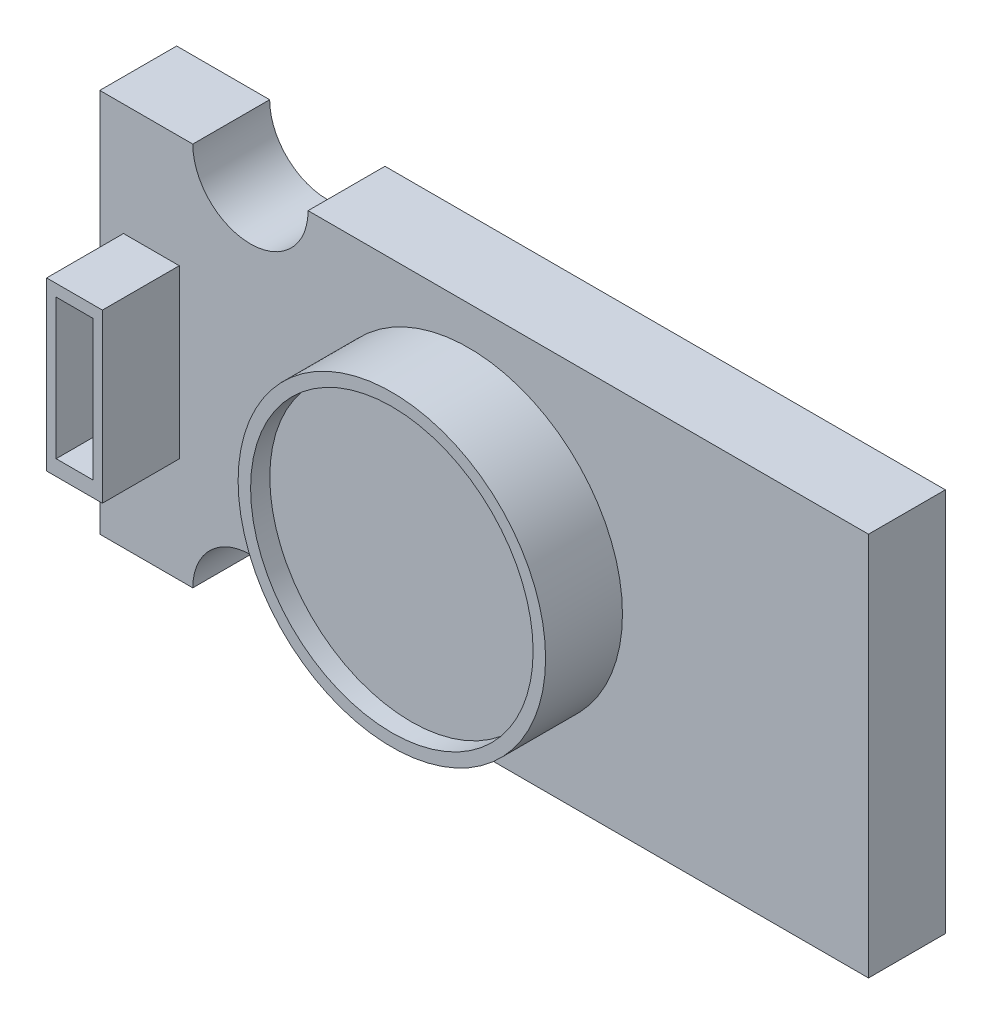
ISO-10303-21;
HEADER;
FILE_DESCRIPTION(('STEP AP214'),'2;1');
FILE_NAME('part.step','',(''),(''),'','','');
FILE_SCHEMA(('AUTOMOTIVE_DESIGN { 1 0 10303 214 1 1 1 1 }'));
ENDSEC;
DATA;
#1=APPLICATION_CONTEXT('core data for automotive mechanical design processes');
#2=APPLICATION_PROTOCOL_DEFINITION('international standard','automotive_design',2000,#1);
#3=PRODUCT_CONTEXT('',#1,'mechanical');
#4=PRODUCT('Part','Part','',(#3));
#5=PRODUCT_RELATED_PRODUCT_CATEGORY('part','',(#4));
#6=PRODUCT_DEFINITION_FORMATION('','',#4);
#7=PRODUCT_DEFINITION_CONTEXT('part definition',#1,'design');
#8=PRODUCT_DEFINITION('design','',#6,#7);
#9=PRODUCT_DEFINITION_SHAPE('','',#8);
#10=(LENGTH_UNIT() NAMED_UNIT(*) SI_UNIT(.MILLI.,.METRE.));
#11=(NAMED_UNIT(*) PLANE_ANGLE_UNIT() SI_UNIT($,.RADIAN.));
#12=(NAMED_UNIT(*) SI_UNIT($,.STERADIAN.) SOLID_ANGLE_UNIT());
#13=UNCERTAINTY_MEASURE_WITH_UNIT(LENGTH_MEASURE(1.E-05),#10,'distance_accuracy_value','');
#14=(GEOMETRIC_REPRESENTATION_CONTEXT(3) GLOBAL_UNCERTAINTY_ASSIGNED_CONTEXT((#13)) GLOBAL_UNIT_ASSIGNED_CONTEXT((#10,
#11,#12)) REPRESENTATION_CONTEXT('',''));
#15=CARTESIAN_POINT('',(0.,0.,0.));
#16=DIRECTION('',(0.,0.,1.));
#17=DIRECTION('',(1.,0.,0.));
#18=AXIS2_PLACEMENT_3D('',#15,#16,#17);
#19=CARTESIAN_POINT('',(0.,0.,2.));
#20=DIRECTION('',(0.,0.,1.));
#21=DIRECTION('',(1.,0.,0.));
#22=AXIS2_PLACEMENT_3D('',#19,#20,#21);
#23=PLANE('',#22);
#24=CARTESIAN_POINT('',(1.18172324453648,3.6206896551724,2.));
#25=DIRECTION('',(0.,0.,1.));
#26=DIRECTION('',(1.,0.,0.));
#27=AXIS2_PLACEMENT_3D('',#24,#25,#26);
#28=CIRCLE('',#27,4.);
#29=CARTESIAN_POINT('',(5.18172324453649,3.6206896551724,2.));
#30=VERTEX_POINT('',#29);
#31=EDGE_CURVE('E215',#30,#30,#28,.T.);
#32=ORIENTED_EDGE('',*,*,#31,.F.);
#33=EDGE_LOOP('',(#32));
#34=FACE_BOUND('',#33,.T.);
#35=CARTESIAN_POINT('',(-4.49737673402625,-1.37931034482759,2.));
#36=DIRECTION('',(0.,0.,1.));
#37=DIRECTION('',(1.,0.,0.));
#38=AXIS2_PLACEMENT_3D('',#35,#36,#37);
#39=CIRCLE('',#38,1.5);
#40=CARTESIAN_POINT('',(-2.99737673402625,-1.37931034482759,2.));
#41=VERTEX_POINT('',#40);
#42=CARTESIAN_POINT('',(-5.99737673402625,-1.37931034482759,2.));
#43=VERTEX_POINT('',#42);
#44=EDGE_CURVE('E221',#41,#43,#39,.T.);
#45=ORIENTED_EDGE('',*,*,#44,.F.);
#46=DIRECTION('',(1.,0.,0.));
#47=VECTOR('',#46,1.);
#48=CARTESIAN_POINT('',(-8.41703599610854,-1.37931034482759,2.));
#49=LINE('',#48,#47);
#50=CARTESIAN_POINT('',(11.5829640038915,-1.37931034482759,2.));
#51=VERTEX_POINT('',#50);
#52=EDGE_CURVE('E246',#41,#51,#49,.T.);
#53=ORIENTED_EDGE('',*,*,#52,.T.);
#54=DIRECTION('',(0.,1.,0.));
#55=VECTOR('',#54,1.);
#56=CARTESIAN_POINT('',(11.5829640038915,8.62068965517241,2.));
#57=LINE('',#56,#55);
#58=CARTESIAN_POINT('',(11.5829640038915,8.62068965517241,2.));
#59=VERTEX_POINT('',#58);
#60=EDGE_CURVE('E251',#51,#59,#57,.T.);
#61=ORIENTED_EDGE('',*,*,#60,.T.);
#62=DIRECTION('',(-1.,0.,0.));
#63=VECTOR('',#62,1.);
#64=CARTESIAN_POINT('',(-8.41703599610854,8.62068965517241,2.));
#65=LINE('',#64,#63);
#66=CARTESIAN_POINT('',(-2.99737673402625,8.62068965517241,2.));
#67=VERTEX_POINT('',#66);
#68=EDGE_CURVE('E254',#59,#67,#65,.T.);
#69=ORIENTED_EDGE('',*,*,#68,.T.);
#70=CARTESIAN_POINT('',(-4.49737673402625,8.62068965517241,2.));
#71=DIRECTION('',(0.,0.,1.));
#72=DIRECTION('',(1.,0.,0.));
#73=AXIS2_PLACEMENT_3D('',#70,#71,#72);
#74=CIRCLE('',#73,1.5);
#75=CARTESIAN_POINT('',(-5.99737673402625,8.62068965517241,2.));
#76=VERTEX_POINT('',#75);
#77=EDGE_CURVE('E234',#76,#67,#74,.T.);
#78=ORIENTED_EDGE('',*,*,#77,.F.);
#79=CARTESIAN_POINT('',(-8.41703599610854,8.62068965517241,2.));
#80=VERTEX_POINT('',#79);
#81=EDGE_CURVE('E253',#76,#80,#65,.T.);
#82=ORIENTED_EDGE('',*,*,#81,.T.);
#83=DIRECTION('',(0.,-1.,0.));
#84=VECTOR('',#83,1.);
#85=CARTESIAN_POINT('',(-8.41703599610854,8.62068965517241,2.));
#86=LINE('',#85,#84);
#87=CARTESIAN_POINT('',(-8.41703599610854,-1.37931034482759,2.));
#88=VERTEX_POINT('',#87);
#89=EDGE_CURVE('E243',#80,#88,#86,.T.);
#90=ORIENTED_EDGE('',*,*,#89,.T.);
#91=EDGE_CURVE('E248',#88,#43,#49,.T.);
#92=ORIENTED_EDGE('',*,*,#91,.T.);
#93=EDGE_LOOP('',(#45,#53,#61,#69,#78,#82,#90,#92));
#94=FACE_BOUND('',#93,.T.);
#95=DIRECTION('',(1.,0.,0.));
#96=VECTOR('',#95,1.);
#97=CARTESIAN_POINT('',(-7.79989683025566,1.35213613112697,2.));
#98=LINE('',#97,#96);
#99=CARTESIAN_POINT('',(-7.79989683025566,1.35213613112697,2.));
#100=VERTEX_POINT('',#99);
#101=CARTESIAN_POINT('',(-6.34925716181844,1.35213613112697,2.));
#102=VERTEX_POINT('',#101);
#103=EDGE_CURVE('E198',#100,#102,#98,.T.);
#104=ORIENTED_EDGE('',*,*,#103,.F.);
#105=DIRECTION('',(0.,-1.,0.));
#106=VECTOR('',#105,1.);
#107=CARTESIAN_POINT('',(-7.79989683025566,5.70405513643863,2.));
#108=LINE('',#107,#106);
#109=CARTESIAN_POINT('',(-7.79989683025566,5.70405513643863,2.));
#110=VERTEX_POINT('',#109);
#111=EDGE_CURVE('E181',#110,#100,#108,.T.);
#112=ORIENTED_EDGE('',*,*,#111,.F.);
#113=DIRECTION('',(-1.,0.,0.));
#114=VECTOR('',#113,1.);
#115=CARTESIAN_POINT('',(-7.79989683025566,5.70405513643863,2.));
#116=LINE('',#115,#114);
#117=CARTESIAN_POINT('',(-6.34925716181844,5.70405513643863,2.));
#118=VERTEX_POINT('',#117);
#119=EDGE_CURVE('E189',#118,#110,#116,.T.);
#120=ORIENTED_EDGE('',*,*,#119,.F.);
#121=DIRECTION('',(0.,1.,0.));
#122=VECTOR('',#121,1.);
#123=CARTESIAN_POINT('',(-6.34925716181844,5.70405513643863,2.));
#124=LINE('',#123,#122);
#125=EDGE_CURVE('E200',#102,#118,#124,.T.);
#126=ORIENTED_EDGE('',*,*,#125,.F.);
#127=EDGE_LOOP('',(#104,#112,#120,#126));
#128=FACE_BOUND('',#127,.T.);
#129=ADVANCED_FACE('F32',(#34,#94,#128),#23,.T.);
#130=CARTESIAN_POINT('',(-8.41703599610854,-1.37931034482759,2.));
#131=DIRECTION('',(0.,1.,0.));
#132=DIRECTION('',(0.,0.,1.));
#133=AXIS2_PLACEMENT_3D('',#130,#131,#132);
#134=PLANE('',#133);
#135=DIRECTION('',(1.,0.,0.));
#136=VECTOR('',#135,1.);
#137=CARTESIAN_POINT('',(-8.41703599610854,-1.37931034482759,0.));
#138=LINE('',#137,#136);
#139=CARTESIAN_POINT('',(-8.41703599610854,-1.37931034482759,0.));
#140=VERTEX_POINT('',#139);
#141=CARTESIAN_POINT('',(-5.99737673402625,-1.37931034482759,0.));
#142=VERTEX_POINT('',#141);
#143=EDGE_CURVE('E261',#140,#142,#138,.T.);
#144=ORIENTED_EDGE('',*,*,#143,.T.);
#145=DIRECTION('',(0.,0.,1.));
#146=VECTOR('',#145,1.);
#147=CARTESIAN_POINT('',(-5.99737673402625,-1.37931034482759,0.));
#148=LINE('',#147,#146);
#149=EDGE_CURVE('E231',#142,#43,#148,.T.);
#150=ORIENTED_EDGE('',*,*,#149,.T.);
#151=ORIENTED_EDGE('',*,*,#91,.F.);
#152=DIRECTION('',(0.,0.,-1.));
#153=VECTOR('',#152,1.);
#154=CARTESIAN_POINT('',(-8.41703599610854,-1.37931034482759,2.));
#155=LINE('',#154,#153);
#156=EDGE_CURVE('E40',#88,#140,#155,.T.);
#157=ORIENTED_EDGE('',*,*,#156,.T.);
#158=EDGE_LOOP('',(#144,#150,#151,#157));
#159=FACE_BOUND('',#158,.T.);
#160=ADVANCED_FACE('F279',(#159),#134,.F.);
#161=CARTESIAN_POINT('',(-8.41703599610854,8.62068965517241,2.));
#162=DIRECTION('',(0.,-1.,0.));
#163=DIRECTION('',(0.,0.,-1.));
#164=AXIS2_PLACEMENT_3D('',#161,#162,#163);
#165=PLANE('',#164);
#166=DIRECTION('',(-1.,0.,0.));
#167=VECTOR('',#166,1.);
#168=CARTESIAN_POINT('',(-8.41703599610854,8.62068965517241,0.));
#169=LINE('',#168,#167);
#170=CARTESIAN_POINT('',(11.5829640038915,8.62068965517241,0.));
#171=VERTEX_POINT('',#170);
#172=CARTESIAN_POINT('',(-2.99737673402625,8.62068965517241,0.));
#173=VERTEX_POINT('',#172);
#174=EDGE_CURVE('E247',#171,#173,#169,.T.);
#175=ORIENTED_EDGE('',*,*,#174,.T.);
#176=DIRECTION('',(0.,0.,1.));
#177=VECTOR('',#176,1.);
#178=CARTESIAN_POINT('',(-2.99737673402625,8.62068965517241,0.));
#179=LINE('',#178,#177);
#180=EDGE_CURVE('E239',#173,#67,#179,.T.);
#181=ORIENTED_EDGE('',*,*,#180,.T.);
#182=ORIENTED_EDGE('',*,*,#68,.F.);
#183=DIRECTION('',(0.,0.,-1.));
#184=VECTOR('',#183,1.);
#185=CARTESIAN_POINT('',(11.5829640038915,8.62068965517241,2.));
#186=LINE('',#185,#184);
#187=EDGE_CURVE('E271',#59,#171,#186,.T.);
#188=ORIENTED_EDGE('',*,*,#187,.T.);
#189=EDGE_LOOP('',(#175,#181,#182,#188));
#190=FACE_BOUND('',#189,.T.);
#191=ADVANCED_FACE('F308',(#190),#165,.F.);
#192=CARTESIAN_POINT('',(-8.41703599610854,8.62068965517241,2.));
#193=DIRECTION('',(1.,0.,0.));
#194=DIRECTION('',(0.,0.,-1.));
#195=AXIS2_PLACEMENT_3D('',#192,#193,#194);
#196=PLANE('',#195);
#197=DIRECTION('',(0.,-1.,0.));
#198=VECTOR('',#197,1.);
#199=CARTESIAN_POINT('',(-8.41703599610854,8.62068965517241,0.));
#200=LINE('',#199,#198);
#201=CARTESIAN_POINT('',(-8.41703599610854,8.62068965517241,0.));
#202=VERTEX_POINT('',#201);
#203=EDGE_CURVE('E242',#202,#140,#200,.T.);
#204=ORIENTED_EDGE('',*,*,#203,.T.);
#205=ORIENTED_EDGE('',*,*,#156,.F.);
#206=ORIENTED_EDGE('',*,*,#89,.F.);
#207=DIRECTION('',(0.,0.,-1.));
#208=VECTOR('',#207,1.);
#209=CARTESIAN_POINT('',(-8.41703599610854,8.62068965517241,2.));
#210=LINE('',#209,#208);
#211=EDGE_CURVE('E257',#80,#202,#210,.T.);
#212=ORIENTED_EDGE('',*,*,#211,.T.);
#213=EDGE_LOOP('',(#204,#205,#206,#212));
#214=FACE_BOUND('',#213,.T.);
#215=ADVANCED_FACE('F34',(#214),#196,.F.);
#216=ORIENTED_EDGE('',*,*,#52,.F.);
#217=DIRECTION('',(0.,0.,1.));
#218=VECTOR('',#217,1.);
#219=CARTESIAN_POINT('',(-2.99737673402625,-1.37931034482759,0.));
#220=LINE('',#219,#218);
#221=CARTESIAN_POINT('',(-2.99737673402625,-1.37931034482759,0.));
#222=VERTEX_POINT('',#221);
#223=EDGE_CURVE('E227',#41,#222,#220,.F.);
#224=ORIENTED_EDGE('',*,*,#223,.T.);
#225=CARTESIAN_POINT('',(11.5829640038915,-1.37931034482759,0.));
#226=VERTEX_POINT('',#225);
#227=EDGE_CURVE('E260',#222,#226,#138,.T.);
#228=ORIENTED_EDGE('',*,*,#227,.T.);
#229=DIRECTION('',(0.,0.,-1.));
#230=VECTOR('',#229,1.);
#231=CARTESIAN_POINT('',(11.5829640038915,-1.37931034482759,2.));
#232=LINE('',#231,#230);
#233=EDGE_CURVE('E274',#51,#226,#232,.T.);
#234=ORIENTED_EDGE('',*,*,#233,.F.);
#235=EDGE_LOOP('',(#216,#224,#228,#234));
#236=FACE_BOUND('',#235,.T.);
#237=ADVANCED_FACE('F294',(#236),#134,.F.);
#238=CARTESIAN_POINT('',(11.5829640038915,8.62068965517241,2.));
#239=DIRECTION('',(-1.,0.,0.));
#240=DIRECTION('',(0.,-1.,0.));
#241=AXIS2_PLACEMENT_3D('',#238,#239,#240);
#242=PLANE('',#241);
#243=DIRECTION('',(0.,1.,0.));
#244=VECTOR('',#243,1.);
#245=CARTESIAN_POINT('',(11.5829640038915,8.62068965517241,0.));
#246=LINE('',#245,#244);
#247=EDGE_CURVE('E264',#226,#171,#246,.T.);
#248=ORIENTED_EDGE('',*,*,#247,.T.);
#249=ORIENTED_EDGE('',*,*,#187,.F.);
#250=ORIENTED_EDGE('',*,*,#60,.F.);
#251=ORIENTED_EDGE('',*,*,#233,.T.);
#252=EDGE_LOOP('',(#248,#249,#250,#251));
#253=FACE_BOUND('',#252,.T.);
#254=ADVANCED_FACE('F311',(#253),#242,.F.);
#255=ORIENTED_EDGE('',*,*,#81,.F.);
#256=DIRECTION('',(0.,0.,1.));
#257=VECTOR('',#256,1.);
#258=CARTESIAN_POINT('',(-5.99737673402625,8.62068965517241,0.));
#259=LINE('',#258,#257);
#260=CARTESIAN_POINT('',(-5.99737673402625,8.62068965517241,0.));
#261=VERTEX_POINT('',#260);
#262=EDGE_CURVE('E236',#76,#261,#259,.F.);
#263=ORIENTED_EDGE('',*,*,#262,.T.);
#264=EDGE_CURVE('E266',#261,#202,#169,.T.);
#265=ORIENTED_EDGE('',*,*,#264,.T.);
#266=ORIENTED_EDGE('',*,*,#211,.F.);
#267=EDGE_LOOP('',(#255,#263,#265,#266));
#268=FACE_BOUND('',#267,.T.);
#269=ADVANCED_FACE('F303',(#268),#165,.F.);
#270=CARTESIAN_POINT('',(0.,0.,0.));
#271=DIRECTION('',(0.,0.,1.));
#272=DIRECTION('',(1.,0.,0.));
#273=AXIS2_PLACEMENT_3D('',#270,#271,#272);
#274=PLANE('',#273);
#275=ORIENTED_EDGE('',*,*,#227,.F.);
#276=CARTESIAN_POINT('',(-4.49737673402625,-1.37931034482759,0.));
#277=DIRECTION('',(0.,0.,1.));
#278=DIRECTION('',(1.,0.,0.));
#279=AXIS2_PLACEMENT_3D('',#276,#277,#278);
#280=CIRCLE('',#279,1.5);
#281=EDGE_CURVE('E224',#222,#142,#280,.T.);
#282=ORIENTED_EDGE('',*,*,#281,.T.);
#283=ORIENTED_EDGE('',*,*,#143,.F.);
#284=ORIENTED_EDGE('',*,*,#203,.F.);
#285=ORIENTED_EDGE('',*,*,#264,.F.);
#286=CARTESIAN_POINT('',(-4.49737673402625,8.62068965517241,0.));
#287=DIRECTION('',(0.,0.,1.));
#288=DIRECTION('',(1.,0.,0.));
#289=AXIS2_PLACEMENT_3D('',#286,#287,#288);
#290=CIRCLE('',#289,1.5);
#291=EDGE_CURVE('E11',#261,#173,#290,.T.);
#292=ORIENTED_EDGE('',*,*,#291,.T.);
#293=ORIENTED_EDGE('',*,*,#174,.F.);
#294=ORIENTED_EDGE('',*,*,#247,.F.);
#295=EDGE_LOOP('',(#275,#282,#283,#284,#285,#292,#293,#294));
#296=FACE_BOUND('',#295,.T.);
#297=ADVANCED_FACE('F287',(#296),#274,.F.);
#298=CARTESIAN_POINT('',(-4.49737673402625,8.62068965517241,0.));
#299=DIRECTION('',(0.,0.,1.));
#300=DIRECTION('',(1.,0.,0.));
#301=AXIS2_PLACEMENT_3D('',#298,#299,#300);
#302=CYLINDRICAL_SURFACE('',#301,1.5);
#303=ORIENTED_EDGE('',*,*,#291,.F.);
#304=ORIENTED_EDGE('',*,*,#262,.F.);
#305=ORIENTED_EDGE('',*,*,#77,.T.);
#306=ORIENTED_EDGE('',*,*,#180,.F.);
#307=EDGE_LOOP('',(#303,#304,#305,#306));
#308=FACE_BOUND('',#307,.T.);
#309=ADVANCED_FACE('F305',(#308),#302,.F.);
#310=CARTESIAN_POINT('',(-4.49737673402625,-1.37931034482759,0.));
#311=DIRECTION('',(0.,0.,1.));
#312=DIRECTION('',(1.,0.,0.));
#313=AXIS2_PLACEMENT_3D('',#310,#311,#312);
#314=CYLINDRICAL_SURFACE('',#313,1.5);
#315=ORIENTED_EDGE('',*,*,#281,.F.);
#316=ORIENTED_EDGE('',*,*,#223,.F.);
#317=ORIENTED_EDGE('',*,*,#44,.T.);
#318=ORIENTED_EDGE('',*,*,#149,.F.);
#319=EDGE_LOOP('',(#315,#316,#317,#318));
#320=FACE_BOUND('',#319,.T.);
#321=ADVANCED_FACE('F290',(#320),#314,.F.);
#322=CARTESIAN_POINT('',(1.18172324453648,3.6206896551724,4.));
#323=DIRECTION('',(0.,0.,-1.));
#324=DIRECTION('',(-1.,0.,0.));
#325=AXIS2_PLACEMENT_3D('',#322,#323,#324);
#326=CYLINDRICAL_SURFACE('',#325,4.);
#327=CARTESIAN_POINT('',(1.18172324453648,3.6206896551724,4.));
#328=DIRECTION('',(0.,0.,1.));
#329=DIRECTION('',(1.,0.,0.));
#330=AXIS2_PLACEMENT_3D('',#327,#328,#329);
#331=CIRCLE('',#330,4.);
#332=CARTESIAN_POINT('',(5.18172324453649,3.6206896551724,4.));
#333=VERTEX_POINT('',#332);
#334=EDGE_CURVE('E218',#333,#333,#331,.T.);
#335=ORIENTED_EDGE('',*,*,#334,.F.);
#336=EDGE_LOOP('',(#335));
#337=FACE_BOUND('',#336,.T.);
#338=ORIENTED_EDGE('',*,*,#31,.T.);
#339=EDGE_LOOP('',(#338));
#340=FACE_BOUND('',#339,.T.);
#341=ADVANCED_FACE('F336',(#337,#340),#326,.T.);
#342=CARTESIAN_POINT('',(1.18172324453648,3.6206896551724,4.));
#343=DIRECTION('',(0.,0.,1.));
#344=DIRECTION('',(1.,0.,0.));
#345=AXIS2_PLACEMENT_3D('',#342,#343,#344);
#346=PLANE('',#345);
#347=CARTESIAN_POINT('',(1.18172324453648,3.6206896551724,4.));
#348=DIRECTION('',(0.,0.,1.));
#349=DIRECTION('',(1.,0.,0.));
#350=AXIS2_PLACEMENT_3D('',#347,#348,#349);
#351=CIRCLE('',#350,3.67543660712438);
#352=CARTESIAN_POINT('',(4.85715985166086,3.6206896551724,4.));
#353=VERTEX_POINT('',#352);
#354=EDGE_CURVE('E211',#353,#353,#351,.T.);
#355=ORIENTED_EDGE('',*,*,#354,.F.);
#356=EDGE_LOOP('',(#355));
#357=FACE_BOUND('',#356,.T.);
#358=ORIENTED_EDGE('',*,*,#334,.T.);
#359=EDGE_LOOP('',(#358));
#360=FACE_BOUND('',#359,.T.);
#361=ADVANCED_FACE('F340',(#357,#360),#346,.T.);
#362=CARTESIAN_POINT('',(1.18172324453648,3.6206896551724,3.5));
#363=DIRECTION('',(0.,0.,1.));
#364=DIRECTION('',(1.,0.,0.));
#365=AXIS2_PLACEMENT_3D('',#362,#363,#364);
#366=CYLINDRICAL_SURFACE('',#365,3.67543660712438);
#367=CARTESIAN_POINT('',(1.18172324453648,3.6206896551724,3.5));
#368=DIRECTION('',(0.,0.,1.));
#369=DIRECTION('',(1.,0.,0.));
#370=AXIS2_PLACEMENT_3D('',#367,#368,#369);
#371=CIRCLE('',#370,3.67543660712438);
#372=CARTESIAN_POINT('',(4.85715985166086,3.6206896551724,3.5));
#373=VERTEX_POINT('',#372);
#374=EDGE_CURVE('E212',#373,#373,#371,.T.);
#375=ORIENTED_EDGE('',*,*,#374,.F.);
#376=EDGE_LOOP('',(#375));
#377=FACE_BOUND('',#376,.T.);
#378=ORIENTED_EDGE('',*,*,#354,.T.);
#379=EDGE_LOOP('',(#378));
#380=FACE_BOUND('',#379,.T.);
#381=ADVANCED_FACE('F346',(#377,#380),#366,.F.);
#382=CARTESIAN_POINT('',(1.18172324453648,3.6206896551724,3.5));
#383=DIRECTION('',(0.,0.,1.));
#384=DIRECTION('',(1.,0.,0.));
#385=AXIS2_PLACEMENT_3D('',#382,#383,#384);
#386=PLANE('',#385);
#387=ORIENTED_EDGE('',*,*,#374,.T.);
#388=EDGE_LOOP('',(#387));
#389=FACE_BOUND('',#388,.T.);
#390=ADVANCED_FACE('F350',(#389),#386,.T.);
#391=CARTESIAN_POINT('',(-7.79989683025566,5.70405513643863,4.));
#392=DIRECTION('',(1.,0.,0.));
#393=DIRECTION('',(0.,0.,-1.));
#394=AXIS2_PLACEMENT_3D('',#391,#392,#393);
#395=PLANE('',#394);
#396=ORIENTED_EDGE('',*,*,#111,.T.);
#397=DIRECTION('',(0.,0.,-1.));
#398=VECTOR('',#397,1.);
#399=CARTESIAN_POINT('',(-7.79989683025566,1.35213613112697,4.));
#400=LINE('',#399,#398);
#401=CARTESIAN_POINT('',(-7.79989683025566,1.35213613112697,4.));
#402=VERTEX_POINT('',#401);
#403=EDGE_CURVE('E209',#402,#100,#400,.T.);
#404=ORIENTED_EDGE('',*,*,#403,.F.);
#405=DIRECTION('',(0.,-1.,0.));
#406=VECTOR('',#405,1.);
#407=CARTESIAN_POINT('',(-7.79989683025566,5.70405513643863,4.));
#408=LINE('',#407,#406);
#409=CARTESIAN_POINT('',(-7.79989683025566,5.70405513643863,4.));
#410=VERTEX_POINT('',#409);
#411=EDGE_CURVE('E185',#410,#402,#408,.T.);
#412=ORIENTED_EDGE('',*,*,#411,.F.);
#413=DIRECTION('',(0.,0.,-1.));
#414=VECTOR('',#413,1.);
#415=CARTESIAN_POINT('',(-7.79989683025566,5.70405513643863,4.));
#416=LINE('',#415,#414);
#417=EDGE_CURVE('E195',#410,#110,#416,.T.);
#418=ORIENTED_EDGE('',*,*,#417,.T.);
#419=EDGE_LOOP('',(#396,#404,#412,#418));
#420=FACE_BOUND('',#419,.T.);
#421=ADVANCED_FACE('F354',(#420),#395,.F.);
#422=CARTESIAN_POINT('',(-7.79989683025566,1.35213613112697,4.));
#423=DIRECTION('',(0.,1.,0.));
#424=DIRECTION('',(0.,0.,1.));
#425=AXIS2_PLACEMENT_3D('',#422,#423,#424);
#426=PLANE('',#425);
#427=ORIENTED_EDGE('',*,*,#103,.T.);
#428=DIRECTION('',(0.,0.,-1.));
#429=VECTOR('',#428,1.);
#430=CARTESIAN_POINT('',(-6.34925716181844,1.35213613112697,4.));
#431=LINE('',#430,#429);
#432=CARTESIAN_POINT('',(-6.34925716181844,1.35213613112697,4.));
#433=VERTEX_POINT('',#432);
#434=EDGE_CURVE('E206',#433,#102,#431,.T.);
#435=ORIENTED_EDGE('',*,*,#434,.F.);
#436=DIRECTION('',(1.,0.,0.));
#437=VECTOR('',#436,1.);
#438=CARTESIAN_POINT('',(-7.79989683025566,1.35213613112697,4.));
#439=LINE('',#438,#437);
#440=EDGE_CURVE('E188',#402,#433,#439,.T.);
#441=ORIENTED_EDGE('',*,*,#440,.F.);
#442=ORIENTED_EDGE('',*,*,#403,.T.);
#443=EDGE_LOOP('',(#427,#435,#441,#442));
#444=FACE_BOUND('',#443,.T.);
#445=ADVANCED_FACE('F358',(#444),#426,.F.);
#446=CARTESIAN_POINT('',(-6.34925716181844,5.70405513643863,4.));
#447=DIRECTION('',(-1.,0.,0.));
#448=DIRECTION('',(0.,0.,1.));
#449=AXIS2_PLACEMENT_3D('',#446,#447,#448);
#450=PLANE('',#449);
#451=ORIENTED_EDGE('',*,*,#125,.T.);
#452=DIRECTION('',(0.,0.,-1.));
#453=VECTOR('',#452,1.);
#454=CARTESIAN_POINT('',(-6.34925716181844,5.70405513643863,4.));
#455=LINE('',#454,#453);
#456=CARTESIAN_POINT('',(-6.34925716181844,5.70405513643863,4.));
#457=VERTEX_POINT('',#456);
#458=EDGE_CURVE('E55',#457,#118,#455,.T.);
#459=ORIENTED_EDGE('',*,*,#458,.F.);
#460=DIRECTION('',(0.,1.,0.));
#461=VECTOR('',#460,1.);
#462=CARTESIAN_POINT('',(-6.34925716181844,5.70405513643863,4.));
#463=LINE('',#462,#461);
#464=EDGE_CURVE('E191',#433,#457,#463,.T.);
#465=ORIENTED_EDGE('',*,*,#464,.F.);
#466=ORIENTED_EDGE('',*,*,#434,.T.);
#467=EDGE_LOOP('',(#451,#459,#465,#466));
#468=FACE_BOUND('',#467,.T.);
#469=ADVANCED_FACE('F362',(#468),#450,.F.);
#470=CARTESIAN_POINT('',(-7.79989683025566,5.70405513643863,4.));
#471=DIRECTION('',(0.,-1.,0.));
#472=DIRECTION('',(0.,0.,-1.));
#473=AXIS2_PLACEMENT_3D('',#470,#471,#472);
#474=PLANE('',#473);
#475=ORIENTED_EDGE('',*,*,#119,.T.);
#476=ORIENTED_EDGE('',*,*,#417,.F.);
#477=DIRECTION('',(-1.,0.,0.));
#478=VECTOR('',#477,1.);
#479=CARTESIAN_POINT('',(-7.79989683025566,5.70405513643863,4.));
#480=LINE('',#479,#478);
#481=EDGE_CURVE('E193',#457,#410,#480,.T.);
#482=ORIENTED_EDGE('',*,*,#481,.F.);
#483=ORIENTED_EDGE('',*,*,#458,.T.);
#484=EDGE_LOOP('',(#475,#476,#482,#483));
#485=FACE_BOUND('',#484,.T.);
#486=ADVANCED_FACE('F366',(#485),#474,.F.);
#487=CARTESIAN_POINT('',(0.,0.,4.));
#488=DIRECTION('',(0.,0.,1.));
#489=DIRECTION('',(1.,0.,0.));
#490=AXIS2_PLACEMENT_3D('',#487,#488,#489);
#491=PLANE('',#490);
#492=DIRECTION('',(0.,-1.,0.));
#493=VECTOR('',#492,1.);
#494=CARTESIAN_POINT('',(-7.55297943988336,5.39540839847327,4.));
#495=LINE('',#494,#493);
#496=CARTESIAN_POINT('',(-7.55297943988336,5.39540839847327,4.));
#497=VERTEX_POINT('',#496);
#498=CARTESIAN_POINT('',(-7.55297943988336,1.75337689048196,4.));
#499=VERTEX_POINT('',#498);
#500=EDGE_CURVE('E47',#497,#499,#495,.T.);
#501=ORIENTED_EDGE('',*,*,#500,.F.);
#502=DIRECTION('',(-1.,0.,0.));
#503=VECTOR('',#502,1.);
#504=CARTESIAN_POINT('',(-7.55297943988336,5.39540839847327,4.));
#505=LINE('',#504,#503);
#506=CARTESIAN_POINT('',(-6.59617455219073,5.39540839847327,4.));
#507=VERTEX_POINT('',#506);
#508=EDGE_CURVE('E166',#507,#497,#505,.T.);
#509=ORIENTED_EDGE('',*,*,#508,.F.);
#510=DIRECTION('',(0.,1.,0.));
#511=VECTOR('',#510,1.);
#512=CARTESIAN_POINT('',(-6.59617455219073,5.39540839847327,4.));
#513=LINE('',#512,#511);
#514=CARTESIAN_POINT('',(-6.59617455219073,1.75337689048196,4.));
#515=VERTEX_POINT('',#514);
#516=EDGE_CURVE('E169',#515,#507,#513,.T.);
#517=ORIENTED_EDGE('',*,*,#516,.F.);
#518=DIRECTION('',(1.,0.,0.));
#519=VECTOR('',#518,1.);
#520=CARTESIAN_POINT('',(-7.55297943988336,1.75337689048196,4.));
#521=LINE('',#520,#519);
#522=EDGE_CURVE('E175',#499,#515,#521,.T.);
#523=ORIENTED_EDGE('',*,*,#522,.F.);
#524=EDGE_LOOP('',(#501,#509,#517,#523));
#525=FACE_BOUND('',#524,.T.);
#526=ORIENTED_EDGE('',*,*,#411,.T.);
#527=ORIENTED_EDGE('',*,*,#440,.T.);
#528=ORIENTED_EDGE('',*,*,#464,.T.);
#529=ORIENTED_EDGE('',*,*,#481,.T.);
#530=EDGE_LOOP('',(#526,#527,#528,#529));
#531=FACE_BOUND('',#530,.T.);
#532=ADVANCED_FACE('F370',(#525,#531),#491,.T.);
#533=CARTESIAN_POINT('',(-7.55297943988336,5.39540839847327,2.5));
#534=DIRECTION('',(-1.,0.,0.));
#535=DIRECTION('',(0.,0.,1.));
#536=AXIS2_PLACEMENT_3D('',#533,#534,#535);
#537=PLANE('',#536);
#538=ORIENTED_EDGE('',*,*,#500,.T.);
#539=DIRECTION('',(0.,0.,1.));
#540=VECTOR('',#539,1.);
#541=CARTESIAN_POINT('',(-7.55297943988336,1.75337689048196,2.5));
#542=LINE('',#541,#540);
#543=CARTESIAN_POINT('',(-7.55297943988336,1.75337689048196,2.5));
#544=VERTEX_POINT('',#543);
#545=EDGE_CURVE('E144',#544,#499,#542,.T.);
#546=ORIENTED_EDGE('',*,*,#545,.F.);
#547=DIRECTION('',(0.,-1.,0.));
#548=VECTOR('',#547,1.);
#549=CARTESIAN_POINT('',(-7.55297943988336,5.39540839847327,2.5));
#550=LINE('',#549,#548);
#551=CARTESIAN_POINT('',(-7.55297943988336,5.39540839847327,2.5));
#552=VERTEX_POINT('',#551);
#553=EDGE_CURVE('E148',#552,#544,#550,.T.);
#554=ORIENTED_EDGE('',*,*,#553,.F.);
#555=DIRECTION('',(0.,0.,1.));
#556=VECTOR('',#555,1.);
#557=CARTESIAN_POINT('',(-7.55297943988336,5.39540839847327,2.5));
#558=LINE('',#557,#556);
#559=EDGE_CURVE('E179',#552,#497,#558,.T.);
#560=ORIENTED_EDGE('',*,*,#559,.T.);
#561=EDGE_LOOP('',(#538,#546,#554,#560));
#562=FACE_BOUND('',#561,.T.);
#563=ADVANCED_FACE('F146',(#562),#537,.F.);
#564=CARTESIAN_POINT('',(-7.55297943988336,5.39540839847327,2.5));
#565=DIRECTION('',(0.,1.,0.));
#566=DIRECTION('',(0.,0.,1.));
#567=AXIS2_PLACEMENT_3D('',#564,#565,#566);
#568=PLANE('',#567);
#569=ORIENTED_EDGE('',*,*,#508,.T.);
#570=ORIENTED_EDGE('',*,*,#559,.F.);
#571=DIRECTION('',(-1.,0.,0.));
#572=VECTOR('',#571,1.);
#573=CARTESIAN_POINT('',(-7.55297943988336,5.39540839847327,2.5));
#574=LINE('',#573,#572);
#575=CARTESIAN_POINT('',(-6.59617455219073,5.39540839847327,2.5));
#576=VERTEX_POINT('',#575);
#577=EDGE_CURVE('E154',#576,#552,#574,.T.);
#578=ORIENTED_EDGE('',*,*,#577,.F.);
#579=DIRECTION('',(0.,0.,1.));
#580=VECTOR('',#579,1.);
#581=CARTESIAN_POINT('',(-6.59617455219073,5.39540839847327,2.5));
#582=LINE('',#581,#580);
#583=EDGE_CURVE('E182',#576,#507,#582,.T.);
#584=ORIENTED_EDGE('',*,*,#583,.T.);
#585=EDGE_LOOP('',(#569,#570,#578,#584));
#586=FACE_BOUND('',#585,.T.);
#587=ADVANCED_FACE('F376',(#586),#568,.F.);
#588=CARTESIAN_POINT('',(-6.59617455219073,5.39540839847327,2.5));
#589=DIRECTION('',(1.,0.,0.));
#590=DIRECTION('',(0.,0.,-1.));
#591=AXIS2_PLACEMENT_3D('',#588,#589,#590);
#592=PLANE('',#591);
#593=ORIENTED_EDGE('',*,*,#516,.T.);
#594=ORIENTED_EDGE('',*,*,#583,.F.);
#595=DIRECTION('',(0.,1.,0.));
#596=VECTOR('',#595,1.);
#597=CARTESIAN_POINT('',(-6.59617455219073,5.39540839847327,2.5));
#598=LINE('',#597,#596);
#599=CARTESIAN_POINT('',(-6.59617455219073,1.75337689048196,2.5));
#600=VERTEX_POINT('',#599);
#601=EDGE_CURVE('E162',#600,#576,#598,.T.);
#602=ORIENTED_EDGE('',*,*,#601,.F.);
#603=DIRECTION('',(0.,0.,1.));
#604=VECTOR('',#603,1.);
#605=CARTESIAN_POINT('',(-6.59617455219073,1.75337689048196,2.5));
#606=LINE('',#605,#604);
#607=EDGE_CURVE('E153',#600,#515,#606,.T.);
#608=ORIENTED_EDGE('',*,*,#607,.T.);
#609=EDGE_LOOP('',(#593,#594,#602,#608));
#610=FACE_BOUND('',#609,.T.);
#611=ADVANCED_FACE('F379',(#610),#592,.F.);
#612=CARTESIAN_POINT('',(-7.55297943988336,1.75337689048196,2.5));
#613=DIRECTION('',(0.,-1.,0.));
#614=DIRECTION('',(0.,0.,-1.));
#615=AXIS2_PLACEMENT_3D('',#612,#613,#614);
#616=PLANE('',#615);
#617=ORIENTED_EDGE('',*,*,#522,.T.);
#618=ORIENTED_EDGE('',*,*,#607,.F.);
#619=DIRECTION('',(1.,0.,0.));
#620=VECTOR('',#619,1.);
#621=CARTESIAN_POINT('',(-7.55297943988336,1.75337689048196,2.5));
#622=LINE('',#621,#620);
#623=EDGE_CURVE('E157',#544,#600,#622,.T.);
#624=ORIENTED_EDGE('',*,*,#623,.F.);
#625=ORIENTED_EDGE('',*,*,#545,.T.);
#626=EDGE_LOOP('',(#617,#618,#624,#625));
#627=FACE_BOUND('',#626,.T.);
#628=ADVANCED_FACE('F158',(#627),#616,.F.);
#629=CARTESIAN_POINT('',(0.,0.,2.5));
#630=DIRECTION('',(0.,0.,1.));
#631=DIRECTION('',(1.,0.,0.));
#632=AXIS2_PLACEMENT_3D('',#629,#630,#631);
#633=PLANE('',#632);
#634=ORIENTED_EDGE('',*,*,#553,.T.);
#635=ORIENTED_EDGE('',*,*,#623,.T.);
#636=ORIENTED_EDGE('',*,*,#601,.T.);
#637=ORIENTED_EDGE('',*,*,#577,.T.);
#638=EDGE_LOOP('',(#634,#635,#636,#637));
#639=FACE_BOUND('',#638,.T.);
#640=ADVANCED_FACE('F164',(#639),#633,.T.);
#641=CLOSED_SHELL('',(#129,#160,#191,#215,#237,#254,#269,#297,#309,#321,#341,#361,#381,#390,
#421,#445,#469,#486,#532,#563,#587,#611,#628,#640));
#642=MANIFOLD_SOLID_BREP('B2',#641);
#643=ADVANCED_BREP_SHAPE_REPRESENTATION('',(#18,#642),#14);
#644=SHAPE_DEFINITION_REPRESENTATION(#9,#643);
ENDSEC;
END-ISO-10303-21;
